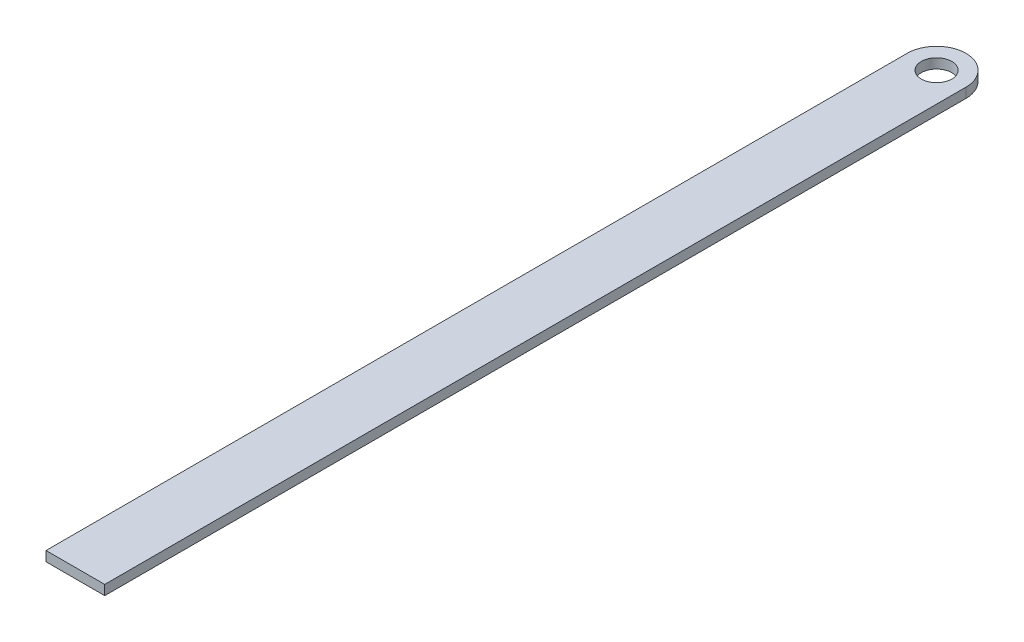
ISO-10303-21;
HEADER;
FILE_DESCRIPTION(('STEP AP214'),'2;1');
FILE_NAME('part.step','',(''),(''),'','','');
FILE_SCHEMA(('AUTOMOTIVE_DESIGN { 1 0 10303 214 1 1 1 1 }'));
ENDSEC;
DATA;
#1=APPLICATION_CONTEXT('core data for automotive mechanical design processes');
#2=APPLICATION_PROTOCOL_DEFINITION('international standard','automotive_design',2000,#1);
#3=PRODUCT_CONTEXT('',#1,'mechanical');
#4=PRODUCT('Part','Part','',(#3));
#5=PRODUCT_RELATED_PRODUCT_CATEGORY('part','',(#4));
#6=PRODUCT_DEFINITION_FORMATION('','',#4);
#7=PRODUCT_DEFINITION_CONTEXT('part definition',#1,'design');
#8=PRODUCT_DEFINITION('design','',#6,#7);
#9=PRODUCT_DEFINITION_SHAPE('','',#8);
#10=(LENGTH_UNIT() NAMED_UNIT(*) SI_UNIT(.MILLI.,.METRE.));
#11=(NAMED_UNIT(*) PLANE_ANGLE_UNIT() SI_UNIT($,.RADIAN.));
#12=(NAMED_UNIT(*) SI_UNIT($,.STERADIAN.) SOLID_ANGLE_UNIT());
#13=UNCERTAINTY_MEASURE_WITH_UNIT(LENGTH_MEASURE(1.E-05),#10,'distance_accuracy_value','');
#14=(GEOMETRIC_REPRESENTATION_CONTEXT(3) GLOBAL_UNCERTAINTY_ASSIGNED_CONTEXT((#13)) GLOBAL_UNIT_ASSIGNED_CONTEXT((#10,
#11,#12)) REPRESENTATION_CONTEXT('',''));
#15=CARTESIAN_POINT('',(0.,0.,0.));
#16=DIRECTION('',(0.,0.,1.));
#17=DIRECTION('',(1.,0.,0.));
#18=AXIS2_PLACEMENT_3D('',#15,#16,#17);
#19=CARTESIAN_POINT('',(4.7625,1.5875,0.));
#20=DIRECTION('',(0.,-1.,0.));
#21=DIRECTION('',(0.,0.,-1.));
#22=AXIS2_PLACEMENT_3D('',#19,#20,#21);
#23=PLANE('',#22);
#24=CARTESIAN_POINT('',(4.7625,1.5875,0.));
#25=DIRECTION('',(0.,1.,0.));
#26=DIRECTION('',(0.,0.,-1.));
#27=AXIS2_PLACEMENT_3D('',#24,#25,#26);
#28=CIRCLE('',#27,4.7625);
#29=CARTESIAN_POINT('',(9.525,1.5875,0.));
#30=VERTEX_POINT('',#29);
#31=CARTESIAN_POINT('',(0.,1.5875,0.));
#32=VERTEX_POINT('',#31);
#33=EDGE_CURVE('E93',#30,#32,#28,.T.);
#34=ORIENTED_EDGE('',*,*,#33,.T.);
#35=DIRECTION('',(0.,0.,1.));
#36=VECTOR('',#35,1.);
#37=CARTESIAN_POINT('',(0.,1.5875,0.));
#38=LINE('',#37,#36);
#39=CARTESIAN_POINT('',(0.,1.5875,139.7));
#40=VERTEX_POINT('',#39);
#41=EDGE_CURVE('E88',#32,#40,#38,.T.);
#42=ORIENTED_EDGE('',*,*,#41,.T.);
#43=DIRECTION('',(1.,0.,0.));
#44=VECTOR('',#43,1.);
#45=CARTESIAN_POINT('',(0.,1.5875,139.7));
#46=LINE('',#45,#44);
#47=CARTESIAN_POINT('',(9.525,1.5875,139.7));
#48=VERTEX_POINT('',#47);
#49=EDGE_CURVE('E90',#40,#48,#46,.T.);
#50=ORIENTED_EDGE('',*,*,#49,.T.);
#51=DIRECTION('',(0.,0.,-1.));
#52=VECTOR('',#51,1.);
#53=CARTESIAN_POINT('',(9.525,1.5875,0.));
#54=LINE('',#53,#52);
#55=EDGE_CURVE('E57',#48,#30,#54,.T.);
#56=ORIENTED_EDGE('',*,*,#55,.T.);
#57=EDGE_LOOP('',(#34,#42,#50,#56));
#58=FACE_BOUND('',#57,.T.);
#59=CARTESIAN_POINT('',(4.7625,1.5875,0.));
#60=DIRECTION('',(0.,1.,0.));
#61=DIRECTION('',(0.,0.,1.));
#62=AXIS2_PLACEMENT_3D('',#59,#60,#61);
#63=CIRCLE('',#62,2.4765);
#64=CARTESIAN_POINT('',(4.7625,1.5875,2.4765));
#65=VERTEX_POINT('',#64);
#66=EDGE_CURVE('E106',#65,#65,#63,.T.);
#67=ORIENTED_EDGE('',*,*,#66,.F.);
#68=EDGE_LOOP('',(#67));
#69=FACE_BOUND('',#68,.T.);
#70=ADVANCED_FACE('F39',(#58,#69),#23,.F.);
#71=CARTESIAN_POINT('',(4.7625,0.,0.));
#72=DIRECTION('',(0.,-1.,0.));
#73=DIRECTION('',(0.,0.,-1.));
#74=AXIS2_PLACEMENT_3D('',#71,#72,#73);
#75=PLANE('',#74);
#76=CARTESIAN_POINT('',(4.7625,0.,0.));
#77=DIRECTION('',(0.,1.,0.));
#78=DIRECTION('',(0.,0.,-1.));
#79=AXIS2_PLACEMENT_3D('',#76,#77,#78);
#80=CIRCLE('',#79,4.7625);
#81=CARTESIAN_POINT('',(9.525,0.,0.));
#82=VERTEX_POINT('',#81);
#83=CARTESIAN_POINT('',(0.,0.,0.));
#84=VERTEX_POINT('',#83);
#85=EDGE_CURVE('E103',#82,#84,#80,.T.);
#86=ORIENTED_EDGE('',*,*,#85,.F.);
#87=DIRECTION('',(0.,0.,-1.));
#88=VECTOR('',#87,1.);
#89=CARTESIAN_POINT('',(9.525,0.,0.));
#90=LINE('',#89,#88);
#91=CARTESIAN_POINT('',(9.525,0.,139.7));
#92=VERTEX_POINT('',#91);
#93=EDGE_CURVE('E78',#92,#82,#90,.T.);
#94=ORIENTED_EDGE('',*,*,#93,.F.);
#95=DIRECTION('',(1.,0.,0.));
#96=VECTOR('',#95,1.);
#97=CARTESIAN_POINT('',(0.,0.,139.7));
#98=LINE('',#97,#96);
#99=CARTESIAN_POINT('',(0.,0.,139.7));
#100=VERTEX_POINT('',#99);
#101=EDGE_CURVE('E71',#100,#92,#98,.T.);
#102=ORIENTED_EDGE('',*,*,#101,.F.);
#103=DIRECTION('',(0.,0.,1.));
#104=VECTOR('',#103,1.);
#105=CARTESIAN_POINT('',(0.,0.,0.));
#106=LINE('',#105,#104);
#107=EDGE_CURVE('E92',#84,#100,#106,.T.);
#108=ORIENTED_EDGE('',*,*,#107,.F.);
#109=EDGE_LOOP('',(#86,#94,#102,#108));
#110=FACE_BOUND('',#109,.T.);
#111=CARTESIAN_POINT('',(4.7625,0.,0.));
#112=DIRECTION('',(0.,1.,0.));
#113=DIRECTION('',(0.,0.,1.));
#114=AXIS2_PLACEMENT_3D('',#111,#112,#113);
#115=CIRCLE('',#114,2.4765);
#116=CARTESIAN_POINT('',(4.7625,0.,2.4765));
#117=VERTEX_POINT('',#116);
#118=EDGE_CURVE('E117',#117,#117,#115,.T.);
#119=ORIENTED_EDGE('',*,*,#118,.T.);
#120=EDGE_LOOP('',(#119));
#121=FACE_BOUND('',#120,.T.);
#122=ADVANCED_FACE('F111',(#110,#121),#75,.T.);
#123=CARTESIAN_POINT('',(4.7625,1.5875,0.));
#124=DIRECTION('',(0.,-1.,0.));
#125=DIRECTION('',(0.,0.,-1.));
#126=AXIS2_PLACEMENT_3D('',#123,#124,#125);
#127=CYLINDRICAL_SURFACE('',#126,4.7625);
#128=ORIENTED_EDGE('',*,*,#85,.T.);
#129=DIRECTION('',(0.,-1.,0.));
#130=VECTOR('',#129,1.);
#131=CARTESIAN_POINT('',(0.,1.5875,0.));
#132=LINE('',#131,#130);
#133=EDGE_CURVE('E11',#32,#84,#132,.T.);
#134=ORIENTED_EDGE('',*,*,#133,.F.);
#135=ORIENTED_EDGE('',*,*,#33,.F.);
#136=DIRECTION('',(0.,-1.,0.));
#137=VECTOR('',#136,1.);
#138=CARTESIAN_POINT('',(9.525,1.5875,0.));
#139=LINE('',#138,#137);
#140=EDGE_CURVE('E97',#30,#82,#139,.T.);
#141=ORIENTED_EDGE('',*,*,#140,.T.);
#142=EDGE_LOOP('',(#128,#134,#135,#141));
#143=FACE_BOUND('',#142,.T.);
#144=ADVANCED_FACE('F41',(#143),#127,.T.);
#145=CARTESIAN_POINT('',(0.,1.5875,0.));
#146=DIRECTION('',(1.,0.,0.));
#147=DIRECTION('',(0.,0.,-1.));
#148=AXIS2_PLACEMENT_3D('',#145,#146,#147);
#149=PLANE('',#148);
#150=ORIENTED_EDGE('',*,*,#107,.T.);
#151=DIRECTION('',(0.,-1.,0.));
#152=VECTOR('',#151,1.);
#153=CARTESIAN_POINT('',(0.,1.5875,139.7));
#154=LINE('',#153,#152);
#155=EDGE_CURVE('E48',#40,#100,#154,.T.);
#156=ORIENTED_EDGE('',*,*,#155,.F.);
#157=ORIENTED_EDGE('',*,*,#41,.F.);
#158=ORIENTED_EDGE('',*,*,#133,.T.);
#159=EDGE_LOOP('',(#150,#156,#157,#158));
#160=FACE_BOUND('',#159,.T.);
#161=ADVANCED_FACE('F94',(#160),#149,.F.);
#162=CARTESIAN_POINT('',(0.,1.5875,139.7));
#163=DIRECTION('',(0.,0.,-1.));
#164=DIRECTION('',(-1.,0.,0.));
#165=AXIS2_PLACEMENT_3D('',#162,#163,#164);
#166=PLANE('',#165);
#167=ORIENTED_EDGE('',*,*,#101,.T.);
#168=DIRECTION('',(0.,-1.,0.));
#169=VECTOR('',#168,1.);
#170=CARTESIAN_POINT('',(9.525,1.5875,139.7));
#171=LINE('',#170,#169);
#172=EDGE_CURVE('E96',#48,#92,#171,.T.);
#173=ORIENTED_EDGE('',*,*,#172,.F.);
#174=ORIENTED_EDGE('',*,*,#49,.F.);
#175=ORIENTED_EDGE('',*,*,#155,.T.);
#176=EDGE_LOOP('',(#167,#173,#174,#175));
#177=FACE_BOUND('',#176,.T.);
#178=ADVANCED_FACE('F100',(#177),#166,.F.);
#179=CARTESIAN_POINT('',(9.525,1.5875,0.));
#180=DIRECTION('',(-1.,0.,0.));
#181=DIRECTION('',(0.,0.,1.));
#182=AXIS2_PLACEMENT_3D('',#179,#180,#181);
#183=PLANE('',#182);
#184=ORIENTED_EDGE('',*,*,#93,.T.);
#185=ORIENTED_EDGE('',*,*,#140,.F.);
#186=ORIENTED_EDGE('',*,*,#55,.F.);
#187=ORIENTED_EDGE('',*,*,#172,.T.);
#188=EDGE_LOOP('',(#184,#185,#186,#187));
#189=FACE_BOUND('',#188,.T.);
#190=ADVANCED_FACE('F112',(#189),#183,.F.);
#191=CARTESIAN_POINT('',(4.7625,1.5875,0.));
#192=DIRECTION('',(0.,-1.,0.));
#193=DIRECTION('',(0.,0.,-1.));
#194=AXIS2_PLACEMENT_3D('',#191,#192,#193);
#195=CYLINDRICAL_SURFACE('',#194,2.4765);
#196=ORIENTED_EDGE('',*,*,#66,.T.);
#197=EDGE_LOOP('',(#196));
#198=FACE_BOUND('',#197,.T.);
#199=ORIENTED_EDGE('',*,*,#118,.F.);
#200=EDGE_LOOP('',(#199));
#201=FACE_BOUND('',#200,.T.);
#202=ADVANCED_FACE('F124',(#198,#201),#195,.F.);
#203=CLOSED_SHELL('',(#70,#122,#144,#161,#178,#190,#202));
#204=MANIFOLD_SOLID_BREP('B2',#203);
#205=ADVANCED_BREP_SHAPE_REPRESENTATION('',(#18,#204),#14);
#206=SHAPE_DEFINITION_REPRESENTATION(#9,#205);
ENDSEC;
END-ISO-10303-21;
